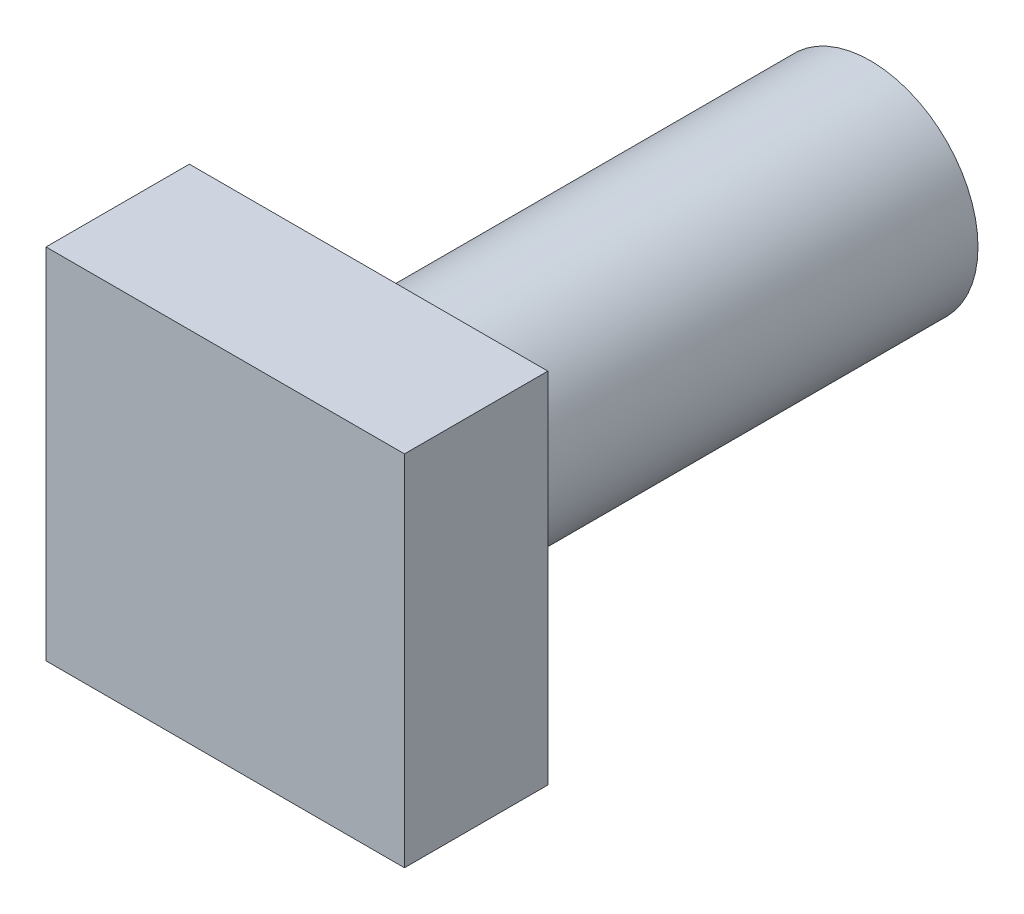
ISO-10303-21;
HEADER;
FILE_DESCRIPTION(('STEP AP214'),'2;1');
FILE_NAME('part.step','',(''),(''),'','','');
FILE_SCHEMA(('AUTOMOTIVE_DESIGN { 1 0 10303 214 1 1 1 1 }'));
ENDSEC;
DATA;
#1=APPLICATION_CONTEXT('core data for automotive mechanical design processes');
#2=APPLICATION_PROTOCOL_DEFINITION('international standard','automotive_design',2000,#1);
#3=PRODUCT_CONTEXT('',#1,'mechanical');
#4=PRODUCT('Part','Part','',(#3));
#5=PRODUCT_RELATED_PRODUCT_CATEGORY('part','',(#4));
#6=PRODUCT_DEFINITION_FORMATION('','',#4);
#7=PRODUCT_DEFINITION_CONTEXT('part definition',#1,'design');
#8=PRODUCT_DEFINITION('design','',#6,#7);
#9=PRODUCT_DEFINITION_SHAPE('','',#8);
#10=(LENGTH_UNIT() NAMED_UNIT(*) SI_UNIT(.MILLI.,.METRE.));
#11=(NAMED_UNIT(*) PLANE_ANGLE_UNIT() SI_UNIT($,.RADIAN.));
#12=(NAMED_UNIT(*) SI_UNIT($,.STERADIAN.) SOLID_ANGLE_UNIT());
#13=UNCERTAINTY_MEASURE_WITH_UNIT(LENGTH_MEASURE(1.E-05),#10,'distance_accuracy_value','');
#14=(GEOMETRIC_REPRESENTATION_CONTEXT(3) GLOBAL_UNCERTAINTY_ASSIGNED_CONTEXT((#13)) GLOBAL_UNIT_ASSIGNED_CONTEXT((#10,
#11,#12)) REPRESENTATION_CONTEXT('',''));
#15=CARTESIAN_POINT('',(0.,0.,0.));
#16=DIRECTION('',(0.,0.,1.));
#17=DIRECTION('',(1.,0.,0.));
#18=AXIS2_PLACEMENT_3D('',#15,#16,#17);
#19=CARTESIAN_POINT('',(0.,0.,-8.89));
#20=DIRECTION('',(0.,0.,1.));
#21=DIRECTION('',(1.,0.,0.));
#22=AXIS2_PLACEMENT_3D('',#19,#20,#21);
#23=CYLINDRICAL_SURFACE('',#22,1.905);
#24=CARTESIAN_POINT('',(0.,0.,-8.89));
#25=DIRECTION('',(0.,0.,1.));
#26=DIRECTION('',(1.,0.,0.));
#27=AXIS2_PLACEMENT_3D('',#24,#25,#26);
#28=CIRCLE('',#27,1.905);
#29=CARTESIAN_POINT('',(1.905,0.,-8.89));
#30=VERTEX_POINT('',#29);
#31=EDGE_CURVE('E11',#30,#30,#28,.T.);
#32=ORIENTED_EDGE('',*,*,#31,.T.);
#33=EDGE_LOOP('',(#32));
#34=FACE_BOUND('',#33,.T.);
#35=CARTESIAN_POINT('',(0.,0.,0.));
#36=DIRECTION('',(0.,0.,1.));
#37=DIRECTION('',(1.,0.,0.));
#38=AXIS2_PLACEMENT_3D('',#35,#36,#37);
#39=CIRCLE('',#38,1.905);
#40=CARTESIAN_POINT('',(1.905,0.,0.));
#41=VERTEX_POINT('',#40);
#42=EDGE_CURVE('E43',#41,#41,#39,.T.);
#43=ORIENTED_EDGE('',*,*,#42,.F.);
#44=EDGE_LOOP('',(#43));
#45=FACE_BOUND('',#44,.T.);
#46=ADVANCED_FACE('F37',(#34,#45),#23,.T.);
#47=CARTESIAN_POINT('',(0.,0.,-8.89));
#48=DIRECTION('',(0.,0.,1.));
#49=DIRECTION('',(1.,0.,0.));
#50=AXIS2_PLACEMENT_3D('',#47,#48,#49);
#51=PLANE('',#50);
#52=ORIENTED_EDGE('',*,*,#31,.F.);
#53=EDGE_LOOP('',(#52));
#54=FACE_BOUND('',#53,.T.);
#55=ADVANCED_FACE('F125',(#54),#51,.F.);
#56=CARTESIAN_POINT('',(3.175,-3.175,2.54));
#57=DIRECTION('',(-1.,0.,0.));
#58=DIRECTION('',(0.,0.,1.));
#59=AXIS2_PLACEMENT_3D('',#56,#57,#58);
#60=PLANE('',#59);
#61=DIRECTION('',(0.,1.,0.));
#62=VECTOR('',#61,1.);
#63=CARTESIAN_POINT('',(3.175,-3.175,0.));
#64=LINE('',#63,#62);
#65=CARTESIAN_POINT('',(3.175,-3.175,0.));
#66=VERTEX_POINT('',#65);
#67=CARTESIAN_POINT('',(3.175,3.175,0.));
#68=VERTEX_POINT('',#67);
#69=EDGE_CURVE('E110',#66,#68,#64,.T.);
#70=ORIENTED_EDGE('',*,*,#69,.T.);
#71=DIRECTION('',(0.,0.,-1.));
#72=VECTOR('',#71,1.);
#73=CARTESIAN_POINT('',(3.175,3.175,2.54));
#74=LINE('',#73,#72);
#75=CARTESIAN_POINT('',(3.175,3.175,2.54));
#76=VERTEX_POINT('',#75);
#77=EDGE_CURVE('E98',#76,#68,#74,.T.);
#78=ORIENTED_EDGE('',*,*,#77,.F.);
#79=DIRECTION('',(0.,1.,0.));
#80=VECTOR('',#79,1.);
#81=CARTESIAN_POINT('',(3.175,-3.175,2.54));
#82=LINE('',#81,#80);
#83=CARTESIAN_POINT('',(3.175,-3.175,2.54));
#84=VERTEX_POINT('',#83);
#85=EDGE_CURVE('E95',#84,#76,#82,.T.);
#86=ORIENTED_EDGE('',*,*,#85,.F.);
#87=DIRECTION('',(0.,0.,-1.));
#88=VECTOR('',#87,1.);
#89=CARTESIAN_POINT('',(3.175,-3.175,2.54));
#90=LINE('',#89,#88);
#91=EDGE_CURVE('E103',#84,#66,#90,.T.);
#92=ORIENTED_EDGE('',*,*,#91,.T.);
#93=EDGE_LOOP('',(#70,#78,#86,#92));
#94=FACE_BOUND('',#93,.T.);
#95=ADVANCED_FACE('F130',(#94),#60,.F.);
#96=CARTESIAN_POINT('',(-3.175,3.175,2.54));
#97=DIRECTION('',(0.,-1.,0.));
#98=DIRECTION('',(0.,0.,-1.));
#99=AXIS2_PLACEMENT_3D('',#96,#97,#98);
#100=PLANE('',#99);
#101=DIRECTION('',(-1.,0.,0.));
#102=VECTOR('',#101,1.);
#103=CARTESIAN_POINT('',(-3.175,3.175,0.));
#104=LINE('',#103,#102);
#105=CARTESIAN_POINT('',(-3.175,3.175,0.));
#106=VERTEX_POINT('',#105);
#107=EDGE_CURVE('E100',#68,#106,#104,.T.);
#108=ORIENTED_EDGE('',*,*,#107,.T.);
#109=DIRECTION('',(0.,0.,-1.));
#110=VECTOR('',#109,1.);
#111=CARTESIAN_POINT('',(-3.175,3.175,2.54));
#112=LINE('',#111,#110);
#113=CARTESIAN_POINT('',(-3.175,3.175,2.54));
#114=VERTEX_POINT('',#113);
#115=EDGE_CURVE('E92',#114,#106,#112,.T.);
#116=ORIENTED_EDGE('',*,*,#115,.F.);
#117=DIRECTION('',(-1.,0.,0.));
#118=VECTOR('',#117,1.);
#119=CARTESIAN_POINT('',(-3.175,3.175,2.54));
#120=LINE('',#119,#118);
#121=EDGE_CURVE('E87',#76,#114,#120,.T.);
#122=ORIENTED_EDGE('',*,*,#121,.F.);
#123=ORIENTED_EDGE('',*,*,#77,.T.);
#124=EDGE_LOOP('',(#108,#116,#122,#123));
#125=FACE_BOUND('',#124,.T.);
#126=ADVANCED_FACE('F96',(#125),#100,.F.);
#127=CARTESIAN_POINT('',(-3.175,-3.175,2.54));
#128=DIRECTION('',(1.,0.,0.));
#129=DIRECTION('',(0.,0.,-1.));
#130=AXIS2_PLACEMENT_3D('',#127,#128,#129);
#131=PLANE('',#130);
#132=DIRECTION('',(0.,-1.,0.));
#133=VECTOR('',#132,1.);
#134=CARTESIAN_POINT('',(-3.175,-3.175,0.));
#135=LINE('',#134,#133);
#136=CARTESIAN_POINT('',(-3.175,-3.175,0.));
#137=VERTEX_POINT('',#136);
#138=EDGE_CURVE('E71',#106,#137,#135,.T.);
#139=ORIENTED_EDGE('',*,*,#138,.T.);
#140=DIRECTION('',(0.,0.,-1.));
#141=VECTOR('',#140,1.);
#142=CARTESIAN_POINT('',(-3.175,-3.175,2.54));
#143=LINE('',#142,#141);
#144=CARTESIAN_POINT('',(-3.175,-3.175,2.54));
#145=VERTEX_POINT('',#144);
#146=EDGE_CURVE('E97',#145,#137,#143,.T.);
#147=ORIENTED_EDGE('',*,*,#146,.F.);
#148=DIRECTION('',(0.,-1.,0.));
#149=VECTOR('',#148,1.);
#150=CARTESIAN_POINT('',(-3.175,-3.175,2.54));
#151=LINE('',#150,#149);
#152=EDGE_CURVE('E89',#114,#145,#151,.T.);
#153=ORIENTED_EDGE('',*,*,#152,.F.);
#154=ORIENTED_EDGE('',*,*,#115,.T.);
#155=EDGE_LOOP('',(#139,#147,#153,#154));
#156=FACE_BOUND('',#155,.T.);
#157=ADVANCED_FACE('F101',(#156),#131,.F.);
#158=CARTESIAN_POINT('',(-3.175,-3.175,2.54));
#159=DIRECTION('',(0.,1.,0.));
#160=DIRECTION('',(0.,0.,1.));
#161=AXIS2_PLACEMENT_3D('',#158,#159,#160);
#162=PLANE('',#161);
#163=DIRECTION('',(1.,0.,0.));
#164=VECTOR('',#163,1.);
#165=CARTESIAN_POINT('',(-3.175,-3.175,0.));
#166=LINE('',#165,#164);
#167=EDGE_CURVE('E76',#137,#66,#166,.T.);
#168=ORIENTED_EDGE('',*,*,#167,.T.);
#169=ORIENTED_EDGE('',*,*,#91,.F.);
#170=DIRECTION('',(1.,0.,0.));
#171=VECTOR('',#170,1.);
#172=CARTESIAN_POINT('',(-3.175,-3.175,2.54));
#173=LINE('',#172,#171);
#174=EDGE_CURVE('E57',#145,#84,#173,.T.);
#175=ORIENTED_EDGE('',*,*,#174,.F.);
#176=ORIENTED_EDGE('',*,*,#146,.T.);
#177=EDGE_LOOP('',(#168,#169,#175,#176));
#178=FACE_BOUND('',#177,.T.);
#179=ADVANCED_FACE('F139',(#178),#162,.F.);
#180=CARTESIAN_POINT('',(0.,0.,2.54));
#181=DIRECTION('',(0.,0.,-1.));
#182=DIRECTION('',(-1.,0.,0.));
#183=AXIS2_PLACEMENT_3D('',#180,#181,#182);
#184=PLANE('',#183);
#185=ORIENTED_EDGE('',*,*,#85,.T.);
#186=ORIENTED_EDGE('',*,*,#121,.T.);
#187=ORIENTED_EDGE('',*,*,#152,.T.);
#188=ORIENTED_EDGE('',*,*,#174,.T.);
#189=EDGE_LOOP('',(#185,#186,#187,#188));
#190=FACE_BOUND('',#189,.T.);
#191=ADVANCED_FACE('F86',(#190),#184,.F.);
#192=CARTESIAN_POINT('',(0.,0.,0.));
#193=DIRECTION('',(0.,0.,-1.));
#194=DIRECTION('',(-1.,0.,0.));
#195=AXIS2_PLACEMENT_3D('',#192,#193,#194);
#196=PLANE('',#195);
#197=ORIENTED_EDGE('',*,*,#42,.T.);
#198=EDGE_LOOP('',(#197));
#199=FACE_BOUND('',#198,.T.);
#200=ORIENTED_EDGE('',*,*,#69,.F.);
#201=ORIENTED_EDGE('',*,*,#167,.F.);
#202=ORIENTED_EDGE('',*,*,#138,.F.);
#203=ORIENTED_EDGE('',*,*,#107,.F.);
#204=EDGE_LOOP('',(#200,#201,#202,#203));
#205=FACE_BOUND('',#204,.T.);
#206=ADVANCED_FACE('F119',(#199,#205),#196,.T.);
#207=CLOSED_SHELL('',(#46,#55,#95,#126,#157,#179,#191,#206));
#208=MANIFOLD_SOLID_BREP('B2',#207);
#209=ADVANCED_BREP_SHAPE_REPRESENTATION('',(#18,#208),#14);
#210=SHAPE_DEFINITION_REPRESENTATION(#9,#209);
ENDSEC;
END-ISO-10303-21;
